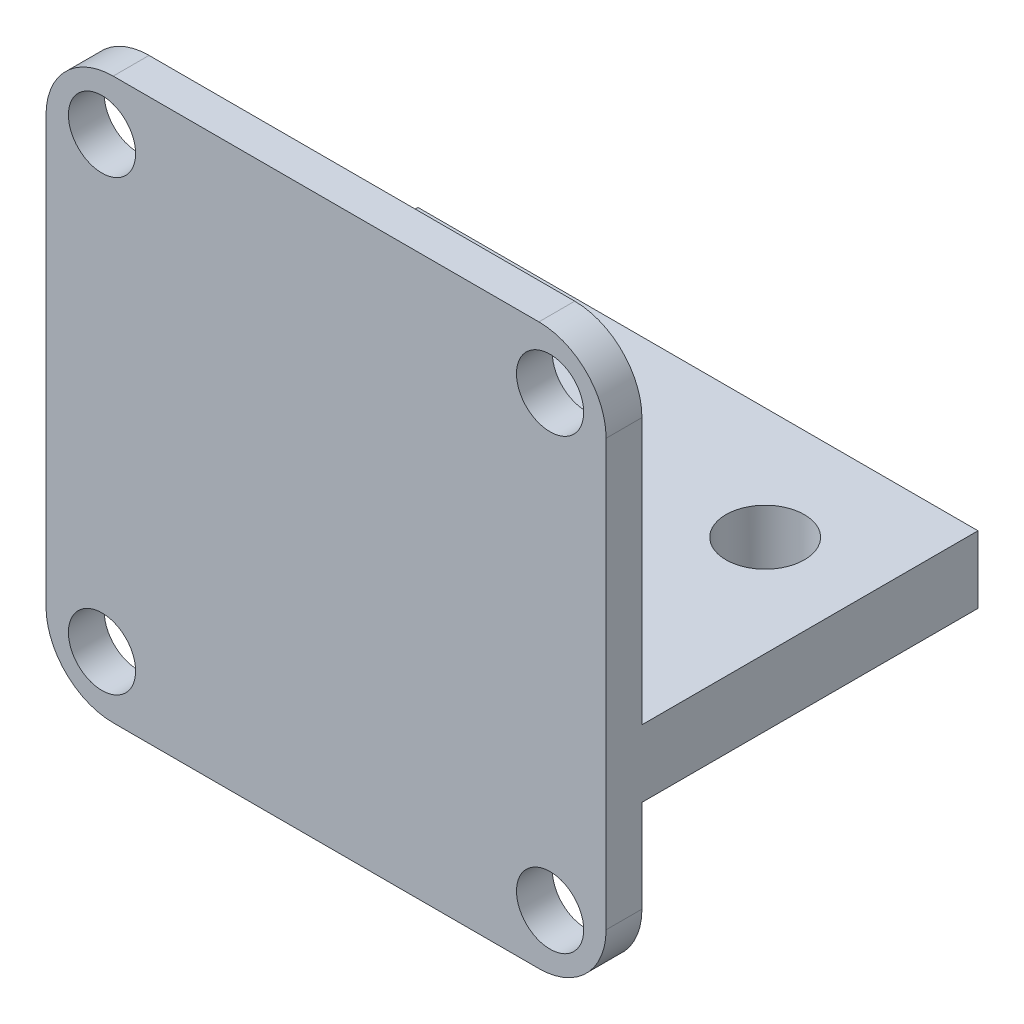
ISO-10303-21;
HEADER;
FILE_DESCRIPTION(('STEP AP214'),'2;1');
FILE_NAME('part.step','',(''),(''),'','','');
FILE_SCHEMA(('AUTOMOTIVE_DESIGN { 1 0 10303 214 1 1 1 1 }'));
ENDSEC;
DATA;
#1=APPLICATION_CONTEXT('core data for automotive mechanical design processes');
#2=APPLICATION_PROTOCOL_DEFINITION('international standard','automotive_design',2000,#1);
#3=PRODUCT_CONTEXT('',#1,'mechanical');
#4=PRODUCT('Part','Part','',(#3));
#5=PRODUCT_RELATED_PRODUCT_CATEGORY('part','',(#4));
#6=PRODUCT_DEFINITION_FORMATION('','',#4);
#7=PRODUCT_DEFINITION_CONTEXT('part definition',#1,'design');
#8=PRODUCT_DEFINITION('design','',#6,#7);
#9=PRODUCT_DEFINITION_SHAPE('','',#8);
#10=(LENGTH_UNIT() NAMED_UNIT(*) SI_UNIT(.MILLI.,.METRE.));
#11=(NAMED_UNIT(*) PLANE_ANGLE_UNIT() SI_UNIT($,.RADIAN.));
#12=(NAMED_UNIT(*) SI_UNIT($,.STERADIAN.) SOLID_ANGLE_UNIT());
#13=UNCERTAINTY_MEASURE_WITH_UNIT(LENGTH_MEASURE(1.E-05),#10,'distance_accuracy_value','');
#14=(GEOMETRIC_REPRESENTATION_CONTEXT(3) GLOBAL_UNCERTAINTY_ASSIGNED_CONTEXT((#13)) GLOBAL_UNIT_ASSIGNED_CONTEXT((#10,
#11,#12)) REPRESENTATION_CONTEXT('',''));
#15=CARTESIAN_POINT('',(0.,0.,0.));
#16=DIRECTION('',(0.,0.,1.));
#17=DIRECTION('',(1.,0.,0.));
#18=AXIS2_PLACEMENT_3D('',#15,#16,#17);
#19=CARTESIAN_POINT('',(-9.50000000000001,-9.50000000000001,0.));
#20=DIRECTION('',(0.,0.,-1.));
#21=DIRECTION('',(-1.,0.,0.));
#22=AXIS2_PLACEMENT_3D('',#19,#20,#21);
#23=PLANE('',#22);
#24=DIRECTION('',(1.,0.,0.));
#25=VECTOR('',#24,1.);
#26=CARTESIAN_POINT('',(12.5,-2.375,0.));
#27=LINE('',#26,#25);
#28=CARTESIAN_POINT('',(-12.5,-2.375,0.));
#29=VERTEX_POINT('',#28);
#30=CARTESIAN_POINT('',(12.5,-2.375,0.));
#31=VERTEX_POINT('',#30);
#32=EDGE_CURVE('E142',#29,#31,#27,.T.);
#33=ORIENTED_EDGE('',*,*,#32,.F.);
#34=DIRECTION('',(0.,-1.,0.));
#35=VECTOR('',#34,1.);
#36=CARTESIAN_POINT('',(-12.5,-9.49999999999998,0.));
#37=LINE('',#36,#35);
#38=CARTESIAN_POINT('',(-12.5,9.49999999999998,0.));
#39=VERTEX_POINT('',#38);
#40=EDGE_CURVE('E181',#39,#29,#37,.T.);
#41=ORIENTED_EDGE('',*,*,#40,.F.);
#42=CARTESIAN_POINT('',(-9.50000000000001,9.5,0.));
#43=DIRECTION('',(0.,0.,1.));
#44=DIRECTION('',(-1.,0.,0.));
#45=AXIS2_PLACEMENT_3D('',#42,#43,#44);
#46=CIRCLE('',#45,3.);
#47=CARTESIAN_POINT('',(-9.49999999999998,12.5,0.));
#48=VERTEX_POINT('',#47);
#49=EDGE_CURVE('E207',#48,#39,#46,.T.);
#50=ORIENTED_EDGE('',*,*,#49,.F.);
#51=DIRECTION('',(-1.,0.,0.));
#52=VECTOR('',#51,1.);
#53=CARTESIAN_POINT('',(-9.49999999999998,12.5,0.));
#54=LINE('',#53,#52);
#55=CARTESIAN_POINT('',(9.49999999999997,12.5,0.));
#56=VERTEX_POINT('',#55);
#57=EDGE_CURVE('E205',#56,#48,#54,.T.);
#58=ORIENTED_EDGE('',*,*,#57,.F.);
#59=CARTESIAN_POINT('',(9.49999999999999,9.5,0.));
#60=DIRECTION('',(0.,0.,1.));
#61=DIRECTION('',(-1.,0.,0.));
#62=AXIS2_PLACEMENT_3D('',#59,#60,#61);
#63=CIRCLE('',#62,3.);
#64=CARTESIAN_POINT('',(12.5,9.49999999999998,0.));
#65=VERTEX_POINT('',#64);
#66=EDGE_CURVE('E203',#65,#56,#63,.T.);
#67=ORIENTED_EDGE('',*,*,#66,.F.);
#68=DIRECTION('',(0.,1.,0.));
#69=VECTOR('',#68,1.);
#70=CARTESIAN_POINT('',(12.5,-9.49999999999998,0.));
#71=LINE('',#70,#69);
#72=EDGE_CURVE('E48',#31,#65,#71,.T.);
#73=ORIENTED_EDGE('',*,*,#72,.F.);
#74=EDGE_LOOP('',(#33,#41,#50,#58,#67,#73));
#75=FACE_BOUND('',#74,.T.);
#76=CARTESIAN_POINT('',(9.99999999999999,9.99999999999999,0.));
#77=DIRECTION('',(0.,0.,1.));
#78=DIRECTION('',(-1.,0.,0.));
#79=AXIS2_PLACEMENT_3D('',#76,#77,#78);
#80=CIRCLE('',#79,1.5);
#81=CARTESIAN_POINT('',(8.49999999999999,9.99999999999999,0.));
#82=VERTEX_POINT('',#81);
#83=EDGE_CURVE('E162',#82,#82,#80,.T.);
#84=ORIENTED_EDGE('',*,*,#83,.T.);
#85=EDGE_LOOP('',(#84));
#86=FACE_BOUND('',#85,.T.);
#87=CARTESIAN_POINT('',(-10.,9.99999999999999,0.));
#88=DIRECTION('',(0.,0.,1.));
#89=DIRECTION('',(1.,0.,0.));
#90=AXIS2_PLACEMENT_3D('',#87,#88,#89);
#91=CIRCLE('',#90,1.5);
#92=CARTESIAN_POINT('',(-8.5,9.99999999999999,0.));
#93=VERTEX_POINT('',#92);
#94=EDGE_CURVE('E168',#93,#93,#91,.T.);
#95=ORIENTED_EDGE('',*,*,#94,.T.);
#96=EDGE_LOOP('',(#95));
#97=FACE_BOUND('',#96,.T.);
#98=ADVANCED_FACE('F33',(#75,#86,#97),#23,.T.);
#99=CARTESIAN_POINT('',(-9.50000000000001,-9.50000000000001,1.6));
#100=DIRECTION('',(0.,0.,-1.));
#101=DIRECTION('',(-1.,0.,0.));
#102=AXIS2_PLACEMENT_3D('',#99,#100,#101);
#103=PLANE('',#102);
#104=CARTESIAN_POINT('',(-9.50000000000001,-9.50000000000001,1.6));
#105=DIRECTION('',(0.,0.,1.));
#106=DIRECTION('',(-1.,0.,0.));
#107=AXIS2_PLACEMENT_3D('',#104,#105,#106);
#108=CIRCLE('',#107,3.);
#109=CARTESIAN_POINT('',(-12.5,-9.49999999999998,1.6));
#110=VERTEX_POINT('',#109);
#111=CARTESIAN_POINT('',(-9.49999999999998,-12.5,1.6));
#112=VERTEX_POINT('',#111);
#113=EDGE_CURVE('E177',#110,#112,#108,.T.);
#114=ORIENTED_EDGE('',*,*,#113,.T.);
#115=DIRECTION('',(1.,0.,0.));
#116=VECTOR('',#115,1.);
#117=CARTESIAN_POINT('',(-9.49999999999998,-12.5,1.6));
#118=LINE('',#117,#116);
#119=CARTESIAN_POINT('',(9.49999999999997,-12.5,1.6));
#120=VERTEX_POINT('',#119);
#121=EDGE_CURVE('E180',#112,#120,#118,.T.);
#122=ORIENTED_EDGE('',*,*,#121,.T.);
#123=CARTESIAN_POINT('',(9.49999999999999,-9.50000000000001,1.6));
#124=DIRECTION('',(0.,0.,1.));
#125=DIRECTION('',(1.,0.,0.));
#126=AXIS2_PLACEMENT_3D('',#123,#124,#125);
#127=CIRCLE('',#126,3.);
#128=CARTESIAN_POINT('',(12.5,-9.50000000000001,1.6));
#129=VERTEX_POINT('',#128);
#130=EDGE_CURVE('E183',#120,#129,#127,.T.);
#131=ORIENTED_EDGE('',*,*,#130,.T.);
#132=DIRECTION('',(0.,1.,0.));
#133=VECTOR('',#132,1.);
#134=CARTESIAN_POINT('',(12.5,-9.49999999999998,1.6));
#135=LINE('',#134,#133);
#136=CARTESIAN_POINT('',(12.5,9.49999999999998,1.6));
#137=VERTEX_POINT('',#136);
#138=EDGE_CURVE('E185',#129,#137,#135,.T.);
#139=ORIENTED_EDGE('',*,*,#138,.T.);
#140=CARTESIAN_POINT('',(9.49999999999999,9.5,1.6));
#141=DIRECTION('',(0.,0.,1.));
#142=DIRECTION('',(-1.,0.,0.));
#143=AXIS2_PLACEMENT_3D('',#140,#141,#142);
#144=CIRCLE('',#143,3.);
#145=CARTESIAN_POINT('',(9.49999999999997,12.5,1.6));
#146=VERTEX_POINT('',#145);
#147=EDGE_CURVE('E187',#137,#146,#144,.T.);
#148=ORIENTED_EDGE('',*,*,#147,.T.);
#149=DIRECTION('',(-1.,0.,0.));
#150=VECTOR('',#149,1.);
#151=CARTESIAN_POINT('',(-9.49999999999998,12.5,1.6));
#152=LINE('',#151,#150);
#153=CARTESIAN_POINT('',(-9.49999999999998,12.5,1.6));
#154=VERTEX_POINT('',#153);
#155=EDGE_CURVE('E189',#146,#154,#152,.T.);
#156=ORIENTED_EDGE('',*,*,#155,.T.);
#157=CARTESIAN_POINT('',(-9.50000000000001,9.5,1.6));
#158=DIRECTION('',(0.,0.,1.));
#159=DIRECTION('',(-1.,0.,0.));
#160=AXIS2_PLACEMENT_3D('',#157,#158,#159);
#161=CIRCLE('',#160,3.);
#162=CARTESIAN_POINT('',(-12.5,9.49999999999998,1.6));
#163=VERTEX_POINT('',#162);
#164=EDGE_CURVE('E191',#154,#163,#161,.T.);
#165=ORIENTED_EDGE('',*,*,#164,.T.);
#166=DIRECTION('',(0.,-1.,0.));
#167=VECTOR('',#166,1.);
#168=CARTESIAN_POINT('',(-12.5,-9.49999999999998,1.6));
#169=LINE('',#168,#167);
#170=EDGE_CURVE('E193',#163,#110,#169,.T.);
#171=ORIENTED_EDGE('',*,*,#170,.T.);
#172=EDGE_LOOP('',(#114,#122,#131,#139,#148,#156,#165,#171));
#173=FACE_BOUND('',#172,.T.);
#174=CARTESIAN_POINT('',(-10.,9.99999999999999,1.6));
#175=DIRECTION('',(0.,0.,1.));
#176=DIRECTION('',(1.,0.,0.));
#177=AXIS2_PLACEMENT_3D('',#174,#175,#176);
#178=CIRCLE('',#177,1.5);
#179=CARTESIAN_POINT('',(-8.5,9.99999999999999,1.6));
#180=VERTEX_POINT('',#179);
#181=EDGE_CURVE('E171',#180,#180,#178,.T.);
#182=ORIENTED_EDGE('',*,*,#181,.F.);
#183=EDGE_LOOP('',(#182));
#184=FACE_BOUND('',#183,.T.);
#185=CARTESIAN_POINT('',(9.99999999999999,9.99999999999999,1.6));
#186=DIRECTION('',(0.,0.,1.));
#187=DIRECTION('',(-1.,0.,0.));
#188=AXIS2_PLACEMENT_3D('',#185,#186,#187);
#189=CIRCLE('',#188,1.5);
#190=CARTESIAN_POINT('',(8.49999999999999,9.99999999999999,1.6));
#191=VERTEX_POINT('',#190);
#192=EDGE_CURVE('E165',#191,#191,#189,.T.);
#193=ORIENTED_EDGE('',*,*,#192,.F.);
#194=EDGE_LOOP('',(#193));
#195=FACE_BOUND('',#194,.T.);
#196=CARTESIAN_POINT('',(9.99999999999998,-10.,1.6));
#197=DIRECTION('',(0.,0.,1.));
#198=DIRECTION('',(1.,0.,0.));
#199=AXIS2_PLACEMENT_3D('',#196,#197,#198);
#200=CIRCLE('',#199,1.5);
#201=CARTESIAN_POINT('',(11.5,-10.,1.6));
#202=VERTEX_POINT('',#201);
#203=EDGE_CURVE('E159',#202,#202,#200,.T.);
#204=ORIENTED_EDGE('',*,*,#203,.F.);
#205=EDGE_LOOP('',(#204));
#206=FACE_BOUND('',#205,.T.);
#207=CARTESIAN_POINT('',(-10.,-10.,1.6));
#208=DIRECTION('',(0.,0.,1.));
#209=DIRECTION('',(-1.,0.,0.));
#210=AXIS2_PLACEMENT_3D('',#207,#208,#209);
#211=CIRCLE('',#210,1.5);
#212=CARTESIAN_POINT('',(-11.5,-10.,1.6));
#213=VERTEX_POINT('',#212);
#214=EDGE_CURVE('E150',#213,#213,#211,.T.);
#215=ORIENTED_EDGE('',*,*,#214,.F.);
#216=EDGE_LOOP('',(#215));
#217=FACE_BOUND('',#216,.T.);
#218=ADVANCED_FACE('F279',(#173,#184,#195,#206,#217),#103,.F.);
#219=DIRECTION('',(-1.,0.,0.));
#220=VECTOR('',#219,1.);
#221=CARTESIAN_POINT('',(12.5,-5.375,0.));
#222=LINE('',#221,#220);
#223=CARTESIAN_POINT('',(12.5,-5.375,0.));
#224=VERTEX_POINT('',#223);
#225=CARTESIAN_POINT('',(-12.5,-5.375,0.));
#226=VERTEX_POINT('',#225);
#227=EDGE_CURVE('E56',#224,#226,#222,.T.);
#228=ORIENTED_EDGE('',*,*,#227,.F.);
#229=CARTESIAN_POINT('',(12.5,-9.50000000000001,0.));
#230=VERTEX_POINT('',#229);
#231=EDGE_CURVE('E146',#230,#224,#71,.T.);
#232=ORIENTED_EDGE('',*,*,#231,.F.);
#233=CARTESIAN_POINT('',(9.49999999999999,-9.50000000000001,0.));
#234=DIRECTION('',(0.,0.,1.));
#235=DIRECTION('',(1.,0.,0.));
#236=AXIS2_PLACEMENT_3D('',#233,#234,#235);
#237=CIRCLE('',#236,3.);
#238=CARTESIAN_POINT('',(9.49999999999997,-12.5,0.));
#239=VERTEX_POINT('',#238);
#240=EDGE_CURVE('E200',#239,#230,#237,.T.);
#241=ORIENTED_EDGE('',*,*,#240,.F.);
#242=DIRECTION('',(1.,0.,0.));
#243=VECTOR('',#242,1.);
#244=CARTESIAN_POINT('',(-9.49999999999998,-12.5,0.));
#245=LINE('',#244,#243);
#246=CARTESIAN_POINT('',(-9.49999999999998,-12.5,0.));
#247=VERTEX_POINT('',#246);
#248=EDGE_CURVE('E198',#247,#239,#245,.T.);
#249=ORIENTED_EDGE('',*,*,#248,.F.);
#250=CARTESIAN_POINT('',(-9.50000000000001,-9.50000000000001,0.));
#251=DIRECTION('',(0.,0.,1.));
#252=DIRECTION('',(-1.,0.,0.));
#253=AXIS2_PLACEMENT_3D('',#250,#251,#252);
#254=CIRCLE('',#253,3.);
#255=CARTESIAN_POINT('',(-12.5,-9.49999999999998,0.));
#256=VERTEX_POINT('',#255);
#257=EDGE_CURVE('E174',#256,#247,#254,.T.);
#258=ORIENTED_EDGE('',*,*,#257,.F.);
#259=EDGE_CURVE('E209',#226,#256,#37,.T.);
#260=ORIENTED_EDGE('',*,*,#259,.F.);
#261=EDGE_LOOP('',(#228,#232,#241,#249,#258,#260));
#262=FACE_BOUND('',#261,.T.);
#263=CARTESIAN_POINT('',(9.99999999999998,-10.,0.));
#264=DIRECTION('',(0.,0.,1.));
#265=DIRECTION('',(1.,0.,0.));
#266=AXIS2_PLACEMENT_3D('',#263,#264,#265);
#267=CIRCLE('',#266,1.5);
#268=CARTESIAN_POINT('',(11.5,-10.,0.));
#269=VERTEX_POINT('',#268);
#270=EDGE_CURVE('E157',#269,#269,#267,.T.);
#271=ORIENTED_EDGE('',*,*,#270,.T.);
#272=EDGE_LOOP('',(#271));
#273=FACE_BOUND('',#272,.T.);
#274=CARTESIAN_POINT('',(-10.,-10.,0.));
#275=DIRECTION('',(0.,0.,1.));
#276=DIRECTION('',(-1.,0.,0.));
#277=AXIS2_PLACEMENT_3D('',#274,#275,#276);
#278=CIRCLE('',#277,1.5);
#279=CARTESIAN_POINT('',(-11.5,-10.,0.));
#280=VERTEX_POINT('',#279);
#281=EDGE_CURVE('E147',#280,#280,#278,.T.);
#282=ORIENTED_EDGE('',*,*,#281,.T.);
#283=EDGE_LOOP('',(#282));
#284=FACE_BOUND('',#283,.T.);
#285=ADVANCED_FACE('F235',(#262,#273,#284),#23,.T.);
#286=CARTESIAN_POINT('',(-9.50000000000001,-9.50000000000001,1.6));
#287=DIRECTION('',(0.,0.,-1.));
#288=DIRECTION('',(-1.,0.,0.));
#289=AXIS2_PLACEMENT_3D('',#286,#287,#288);
#290=CYLINDRICAL_SURFACE('',#289,3.);
#291=ORIENTED_EDGE('',*,*,#257,.T.);
#292=DIRECTION('',(0.,0.,-1.));
#293=VECTOR('',#292,1.);
#294=CARTESIAN_POINT('',(-9.49999999999998,-12.5,1.6));
#295=LINE('',#294,#293);
#296=EDGE_CURVE('E11',#112,#247,#295,.T.);
#297=ORIENTED_EDGE('',*,*,#296,.F.);
#298=ORIENTED_EDGE('',*,*,#113,.F.);
#299=DIRECTION('',(0.,0.,-1.));
#300=VECTOR('',#299,1.);
#301=CARTESIAN_POINT('',(-12.5,-9.49999999999998,1.6));
#302=LINE('',#301,#300);
#303=EDGE_CURVE('E195',#110,#256,#302,.T.);
#304=ORIENTED_EDGE('',*,*,#303,.T.);
#305=EDGE_LOOP('',(#291,#297,#298,#304));
#306=FACE_BOUND('',#305,.T.);
#307=ADVANCED_FACE('F35',(#306),#290,.T.);
#308=CARTESIAN_POINT('',(-9.49999999999998,-12.5,1.6));
#309=DIRECTION('',(0.,1.,0.));
#310=DIRECTION('',(0.,0.,1.));
#311=AXIS2_PLACEMENT_3D('',#308,#309,#310);
#312=PLANE('',#311);
#313=ORIENTED_EDGE('',*,*,#248,.T.);
#314=DIRECTION('',(0.,0.,-1.));
#315=VECTOR('',#314,1.);
#316=CARTESIAN_POINT('',(9.49999999999997,-12.5,1.6));
#317=LINE('',#316,#315);
#318=EDGE_CURVE('E41',#120,#239,#317,.T.);
#319=ORIENTED_EDGE('',*,*,#318,.F.);
#320=ORIENTED_EDGE('',*,*,#121,.F.);
#321=ORIENTED_EDGE('',*,*,#296,.T.);
#322=EDGE_LOOP('',(#313,#319,#320,#321));
#323=FACE_BOUND('',#322,.T.);
#324=ADVANCED_FACE('F239',(#323),#312,.F.);
#325=CARTESIAN_POINT('',(9.49999999999999,-9.50000000000001,1.6));
#326=DIRECTION('',(0.,0.,-1.));
#327=DIRECTION('',(-1.,0.,0.));
#328=AXIS2_PLACEMENT_3D('',#325,#326,#327);
#329=CYLINDRICAL_SURFACE('',#328,3.);
#330=ORIENTED_EDGE('',*,*,#240,.T.);
#331=DIRECTION('',(0.,0.,-1.));
#332=VECTOR('',#331,1.);
#333=CARTESIAN_POINT('',(12.5,-9.50000000000001,1.6));
#334=LINE('',#333,#332);
#335=EDGE_CURVE('E226',#129,#230,#334,.T.);
#336=ORIENTED_EDGE('',*,*,#335,.F.);
#337=ORIENTED_EDGE('',*,*,#130,.F.);
#338=ORIENTED_EDGE('',*,*,#318,.T.);
#339=EDGE_LOOP('',(#330,#336,#337,#338));
#340=FACE_BOUND('',#339,.T.);
#341=ADVANCED_FACE('F232',(#340),#329,.T.);
#342=CARTESIAN_POINT('',(12.5,-9.49999999999998,1.6));
#343=DIRECTION('',(-1.,0.,0.));
#344=DIRECTION('',(0.,0.,1.));
#345=AXIS2_PLACEMENT_3D('',#342,#343,#344);
#346=PLANE('',#345);
#347=ORIENTED_EDGE('',*,*,#231,.T.);
#348=DIRECTION('',(0.,0.,1.));
#349=VECTOR('',#348,1.);
#350=CARTESIAN_POINT('',(12.5,-5.375,-15.));
#351=LINE('',#350,#349);
#352=CARTESIAN_POINT('',(12.5,-5.375,-15.));
#353=VERTEX_POINT('',#352);
#354=EDGE_CURVE('E127',#353,#224,#351,.T.);
#355=ORIENTED_EDGE('',*,*,#354,.F.);
#356=DIRECTION('',(0.,-1.,0.));
#357=VECTOR('',#356,1.);
#358=CARTESIAN_POINT('',(12.5,-5.375,-15.));
#359=LINE('',#358,#357);
#360=CARTESIAN_POINT('',(12.5,-2.375,-15.));
#361=VERTEX_POINT('',#360);
#362=EDGE_CURVE('E133',#361,#353,#359,.T.);
#363=ORIENTED_EDGE('',*,*,#362,.F.);
#364=DIRECTION('',(0.,0.,1.));
#365=VECTOR('',#364,1.);
#366=CARTESIAN_POINT('',(12.5,-2.375,-15.));
#367=LINE('',#366,#365);
#368=EDGE_CURVE('E255',#361,#31,#367,.T.);
#369=ORIENTED_EDGE('',*,*,#368,.T.);
#370=ORIENTED_EDGE('',*,*,#72,.T.);
#371=DIRECTION('',(0.,0.,-1.));
#372=VECTOR('',#371,1.);
#373=CARTESIAN_POINT('',(12.5,9.49999999999998,1.6));
#374=LINE('',#373,#372);
#375=EDGE_CURVE('E223',#137,#65,#374,.T.);
#376=ORIENTED_EDGE('',*,*,#375,.F.);
#377=ORIENTED_EDGE('',*,*,#138,.F.);
#378=ORIENTED_EDGE('',*,*,#335,.T.);
#379=EDGE_LOOP('',(#347,#355,#363,#369,#370,#376,#377,#378));
#380=FACE_BOUND('',#379,.T.);
#381=ADVANCED_FACE('F144',(#380),#346,.F.);
#382=CARTESIAN_POINT('',(9.49999999999999,9.5,1.6));
#383=DIRECTION('',(0.,0.,-1.));
#384=DIRECTION('',(-1.,0.,0.));
#385=AXIS2_PLACEMENT_3D('',#382,#383,#384);
#386=CYLINDRICAL_SURFACE('',#385,3.);
#387=ORIENTED_EDGE('',*,*,#66,.T.);
#388=DIRECTION('',(0.,0.,-1.));
#389=VECTOR('',#388,1.);
#390=CARTESIAN_POINT('',(9.49999999999997,12.5,1.6));
#391=LINE('',#390,#389);
#392=EDGE_CURVE('E220',#146,#56,#391,.T.);
#393=ORIENTED_EDGE('',*,*,#392,.F.);
#394=ORIENTED_EDGE('',*,*,#147,.F.);
#395=ORIENTED_EDGE('',*,*,#375,.T.);
#396=EDGE_LOOP('',(#387,#393,#394,#395));
#397=FACE_BOUND('',#396,.T.);
#398=ADVANCED_FACE('F275',(#397),#386,.T.);
#399=CARTESIAN_POINT('',(-9.49999999999998,12.5,1.6));
#400=DIRECTION('',(0.,-1.,0.));
#401=DIRECTION('',(0.,0.,-1.));
#402=AXIS2_PLACEMENT_3D('',#399,#400,#401);
#403=PLANE('',#402);
#404=ORIENTED_EDGE('',*,*,#57,.T.);
#405=DIRECTION('',(0.,0.,-1.));
#406=VECTOR('',#405,1.);
#407=CARTESIAN_POINT('',(-9.49999999999998,12.5,1.6));
#408=LINE('',#407,#406);
#409=EDGE_CURVE('E217',#154,#48,#408,.T.);
#410=ORIENTED_EDGE('',*,*,#409,.F.);
#411=ORIENTED_EDGE('',*,*,#155,.F.);
#412=ORIENTED_EDGE('',*,*,#392,.T.);
#413=EDGE_LOOP('',(#404,#410,#411,#412));
#414=FACE_BOUND('',#413,.T.);
#415=ADVANCED_FACE('F271',(#414),#403,.F.);
#416=CARTESIAN_POINT('',(-9.50000000000001,9.5,1.6));
#417=DIRECTION('',(0.,0.,-1.));
#418=DIRECTION('',(-1.,0.,0.));
#419=AXIS2_PLACEMENT_3D('',#416,#417,#418);
#420=CYLINDRICAL_SURFACE('',#419,3.);
#421=ORIENTED_EDGE('',*,*,#49,.T.);
#422=DIRECTION('',(0.,0.,-1.));
#423=VECTOR('',#422,1.);
#424=CARTESIAN_POINT('',(-12.5,9.49999999999998,1.6));
#425=LINE('',#424,#423);
#426=EDGE_CURVE('E214',#163,#39,#425,.T.);
#427=ORIENTED_EDGE('',*,*,#426,.F.);
#428=ORIENTED_EDGE('',*,*,#164,.F.);
#429=ORIENTED_EDGE('',*,*,#409,.T.);
#430=EDGE_LOOP('',(#421,#427,#428,#429));
#431=FACE_BOUND('',#430,.T.);
#432=ADVANCED_FACE('F266',(#431),#420,.T.);
#433=CARTESIAN_POINT('',(-12.5,-9.49999999999998,1.6));
#434=DIRECTION('',(1.,0.,0.));
#435=DIRECTION('',(0.,0.,-1.));
#436=AXIS2_PLACEMENT_3D('',#433,#434,#435);
#437=PLANE('',#436);
#438=ORIENTED_EDGE('',*,*,#40,.T.);
#439=DIRECTION('',(0.,0.,1.));
#440=VECTOR('',#439,1.);
#441=CARTESIAN_POINT('',(-12.5,-2.375,-15.));
#442=LINE('',#441,#440);
#443=CARTESIAN_POINT('',(-12.5,-2.375,-15.));
#444=VERTEX_POINT('',#443);
#445=EDGE_CURVE('E152',#444,#29,#442,.T.);
#446=ORIENTED_EDGE('',*,*,#445,.F.);
#447=DIRECTION('',(0.,1.,0.));
#448=VECTOR('',#447,1.);
#449=CARTESIAN_POINT('',(-12.5,-5.375,-15.));
#450=LINE('',#449,#448);
#451=CARTESIAN_POINT('',(-12.5,-5.375,-15.));
#452=VERTEX_POINT('',#451);
#453=EDGE_CURVE('E132',#452,#444,#450,.T.);
#454=ORIENTED_EDGE('',*,*,#453,.F.);
#455=DIRECTION('',(0.,0.,1.));
#456=VECTOR('',#455,1.);
#457=CARTESIAN_POINT('',(-12.5,-5.375,-15.));
#458=LINE('',#457,#456);
#459=EDGE_CURVE('E129',#452,#226,#458,.T.);
#460=ORIENTED_EDGE('',*,*,#459,.T.);
#461=ORIENTED_EDGE('',*,*,#259,.T.);
#462=ORIENTED_EDGE('',*,*,#303,.F.);
#463=ORIENTED_EDGE('',*,*,#170,.F.);
#464=ORIENTED_EDGE('',*,*,#426,.T.);
#465=EDGE_LOOP('',(#438,#446,#454,#460,#461,#462,#463,#464));
#466=FACE_BOUND('',#465,.T.);
#467=ADVANCED_FACE('F245',(#466),#437,.F.);
#468=CARTESIAN_POINT('',(-10.,9.99999999999999,1.6));
#469=DIRECTION('',(0.,0.,-1.));
#470=DIRECTION('',(-1.,0.,0.));
#471=AXIS2_PLACEMENT_3D('',#468,#469,#470);
#472=CYLINDRICAL_SURFACE('',#471,1.5);
#473=ORIENTED_EDGE('',*,*,#181,.T.);
#474=EDGE_LOOP('',(#473));
#475=FACE_BOUND('',#474,.T.);
#476=ORIENTED_EDGE('',*,*,#94,.F.);
#477=EDGE_LOOP('',(#476));
#478=FACE_BOUND('',#477,.T.);
#479=ADVANCED_FACE('F333',(#475,#478),#472,.F.);
#480=CARTESIAN_POINT('',(9.99999999999999,9.99999999999999,1.6));
#481=DIRECTION('',(0.,0.,-1.));
#482=DIRECTION('',(-1.,0.,0.));
#483=AXIS2_PLACEMENT_3D('',#480,#481,#482);
#484=CYLINDRICAL_SURFACE('',#483,1.5);
#485=ORIENTED_EDGE('',*,*,#192,.T.);
#486=EDGE_LOOP('',(#485));
#487=FACE_BOUND('',#486,.T.);
#488=ORIENTED_EDGE('',*,*,#83,.F.);
#489=EDGE_LOOP('',(#488));
#490=FACE_BOUND('',#489,.T.);
#491=ADVANCED_FACE('F323',(#487,#490),#484,.F.);
#492=CARTESIAN_POINT('',(9.99999999999998,-10.,1.6));
#493=DIRECTION('',(0.,0.,-1.));
#494=DIRECTION('',(-1.,0.,0.));
#495=AXIS2_PLACEMENT_3D('',#492,#493,#494);
#496=CYLINDRICAL_SURFACE('',#495,1.5);
#497=ORIENTED_EDGE('',*,*,#203,.T.);
#498=EDGE_LOOP('',(#497));
#499=FACE_BOUND('',#498,.T.);
#500=ORIENTED_EDGE('',*,*,#270,.F.);
#501=EDGE_LOOP('',(#500));
#502=FACE_BOUND('',#501,.T.);
#503=ADVANCED_FACE('F294',(#499,#502),#496,.F.);
#504=CARTESIAN_POINT('',(-10.,-10.,1.6));
#505=DIRECTION('',(0.,0.,-1.));
#506=DIRECTION('',(-1.,0.,0.));
#507=AXIS2_PLACEMENT_3D('',#504,#505,#506);
#508=CYLINDRICAL_SURFACE('',#507,1.5);
#509=ORIENTED_EDGE('',*,*,#214,.T.);
#510=EDGE_LOOP('',(#509));
#511=FACE_BOUND('',#510,.T.);
#512=ORIENTED_EDGE('',*,*,#281,.F.);
#513=EDGE_LOOP('',(#512));
#514=FACE_BOUND('',#513,.T.);
#515=ADVANCED_FACE('F291',(#511,#514),#508,.F.);
#516=CARTESIAN_POINT('',(12.5,-5.375,-15.));
#517=DIRECTION('',(0.,1.,0.));
#518=DIRECTION('',(0.,0.,1.));
#519=AXIS2_PLACEMENT_3D('',#516,#517,#518);
#520=PLANE('',#519);
#521=CARTESIAN_POINT('',(8.,-5.375,-9.99999999999999));
#522=DIRECTION('',(0.,1.,0.));
#523=DIRECTION('',(0.,0.,1.));
#524=AXIS2_PLACEMENT_3D('',#521,#522,#523);
#525=CIRCLE('',#524,1.75);
#526=CARTESIAN_POINT('',(8.,-5.375,-8.24999999999999));
#527=VERTEX_POINT('',#526);
#528=EDGE_CURVE('E464',#527,#527,#525,.T.);
#529=ORIENTED_EDGE('',*,*,#528,.T.);
#530=EDGE_LOOP('',(#529));
#531=FACE_BOUND('',#530,.T.);
#532=CARTESIAN_POINT('',(-8.,-5.375,-10.));
#533=DIRECTION('',(0.,1.,0.));
#534=DIRECTION('',(0.,0.,1.));
#535=AXIS2_PLACEMENT_3D('',#532,#533,#534);
#536=CIRCLE('',#535,1.75);
#537=CARTESIAN_POINT('',(-8.,-5.375,-8.25));
#538=VERTEX_POINT('',#537);
#539=EDGE_CURVE('E246',#538,#538,#536,.T.);
#540=ORIENTED_EDGE('',*,*,#539,.T.);
#541=EDGE_LOOP('',(#540));
#542=FACE_BOUND('',#541,.T.);
#543=ORIENTED_EDGE('',*,*,#227,.T.);
#544=ORIENTED_EDGE('',*,*,#459,.F.);
#545=DIRECTION('',(-1.,0.,0.));
#546=VECTOR('',#545,1.);
#547=CARTESIAN_POINT('',(12.5,-5.375,-15.));
#548=LINE('',#547,#546);
#549=EDGE_CURVE('E123',#353,#452,#548,.T.);
#550=ORIENTED_EDGE('',*,*,#549,.F.);
#551=ORIENTED_EDGE('',*,*,#354,.T.);
#552=EDGE_LOOP('',(#543,#544,#550,#551));
#553=FACE_BOUND('',#552,.T.);
#554=ADVANCED_FACE('F125',(#531,#542,#553),#520,.F.);
#555=CARTESIAN_POINT('',(12.5,-2.375,-15.));
#556=DIRECTION('',(0.,-1.,0.));
#557=DIRECTION('',(0.,0.,-1.));
#558=AXIS2_PLACEMENT_3D('',#555,#556,#557);
#559=PLANE('',#558);
#560=CARTESIAN_POINT('',(8.,-2.375,-9.99999999999999));
#561=DIRECTION('',(0.,1.,0.));
#562=DIRECTION('',(0.,0.,-1.));
#563=AXIS2_PLACEMENT_3D('',#560,#561,#562);
#564=CIRCLE('',#563,1.75);
#565=CARTESIAN_POINT('',(8.,-2.375,-11.75));
#566=VERTEX_POINT('',#565);
#567=EDGE_CURVE('E461',#566,#566,#564,.T.);
#568=ORIENTED_EDGE('',*,*,#567,.F.);
#569=EDGE_LOOP('',(#568));
#570=FACE_BOUND('',#569,.T.);
#571=CARTESIAN_POINT('',(-8.,-2.375,-10.));
#572=DIRECTION('',(0.,1.,0.));
#573=DIRECTION('',(0.,0.,1.));
#574=AXIS2_PLACEMENT_3D('',#571,#572,#573);
#575=CIRCLE('',#574,1.75);
#576=CARTESIAN_POINT('',(-8.,-2.375,-8.25));
#577=VERTEX_POINT('',#576);
#578=EDGE_CURVE('E250',#577,#577,#575,.T.);
#579=ORIENTED_EDGE('',*,*,#578,.F.);
#580=EDGE_LOOP('',(#579));
#581=FACE_BOUND('',#580,.T.);
#582=ORIENTED_EDGE('',*,*,#32,.T.);
#583=ORIENTED_EDGE('',*,*,#368,.F.);
#584=DIRECTION('',(1.,0.,0.));
#585=VECTOR('',#584,1.);
#586=CARTESIAN_POINT('',(12.5,-2.375,-15.));
#587=LINE('',#586,#585);
#588=EDGE_CURVE('E138',#444,#361,#587,.T.);
#589=ORIENTED_EDGE('',*,*,#588,.F.);
#590=ORIENTED_EDGE('',*,*,#445,.T.);
#591=EDGE_LOOP('',(#582,#583,#589,#590));
#592=FACE_BOUND('',#591,.T.);
#593=ADVANCED_FACE('F259',(#570,#581,#592),#559,.F.);
#594=CARTESIAN_POINT('',(0.,0.,-15.));
#595=DIRECTION('',(0.,0.,1.));
#596=DIRECTION('',(1.,0.,0.));
#597=AXIS2_PLACEMENT_3D('',#594,#595,#596);
#598=PLANE('',#597);
#599=ORIENTED_EDGE('',*,*,#362,.T.);
#600=ORIENTED_EDGE('',*,*,#549,.T.);
#601=ORIENTED_EDGE('',*,*,#453,.T.);
#602=ORIENTED_EDGE('',*,*,#588,.T.);
#603=EDGE_LOOP('',(#599,#600,#601,#602));
#604=FACE_BOUND('',#603,.T.);
#605=ADVANCED_FACE('F136',(#604),#598,.F.);
#606=CARTESIAN_POINT('',(-8.,-12.5,-10.));
#607=DIRECTION('',(0.,1.,0.));
#608=DIRECTION('',(0.,0.,1.));
#609=AXIS2_PLACEMENT_3D('',#606,#607,#608);
#610=CYLINDRICAL_SURFACE('',#609,1.75);
#611=ORIENTED_EDGE('',*,*,#578,.T.);
#612=EDGE_LOOP('',(#611));
#613=FACE_BOUND('',#612,.T.);
#614=ORIENTED_EDGE('',*,*,#539,.F.);
#615=EDGE_LOOP('',(#614));
#616=FACE_BOUND('',#615,.T.);
#617=ADVANCED_FACE('F436',(#613,#616),#610,.F.);
#618=CARTESIAN_POINT('',(8.,-12.5,-9.99999999999999));
#619=DIRECTION('',(0.,1.,0.));
#620=DIRECTION('',(0.,0.,1.));
#621=AXIS2_PLACEMENT_3D('',#618,#619,#620);
#622=CYLINDRICAL_SURFACE('',#621,1.75);
#623=ORIENTED_EDGE('',*,*,#567,.T.);
#624=EDGE_LOOP('',(#623));
#625=FACE_BOUND('',#624,.T.);
#626=ORIENTED_EDGE('',*,*,#528,.F.);
#627=EDGE_LOOP('',(#626));
#628=FACE_BOUND('',#627,.T.);
#629=ADVANCED_FACE('F441',(#625,#628),#622,.F.);
#630=CLOSED_SHELL('',(#98,#218,#285,#307,#324,#341,#381,#398,#415,#432,#467,#479,#491,#503,#515,
#554,#593,#605,#617,#629));
#631=MANIFOLD_SOLID_BREP('B2',#630);
#632=ADVANCED_BREP_SHAPE_REPRESENTATION('',(#18,#631),#14);
#633=SHAPE_DEFINITION_REPRESENTATION(#9,#632);
ENDSEC;
END-ISO-10303-21;
